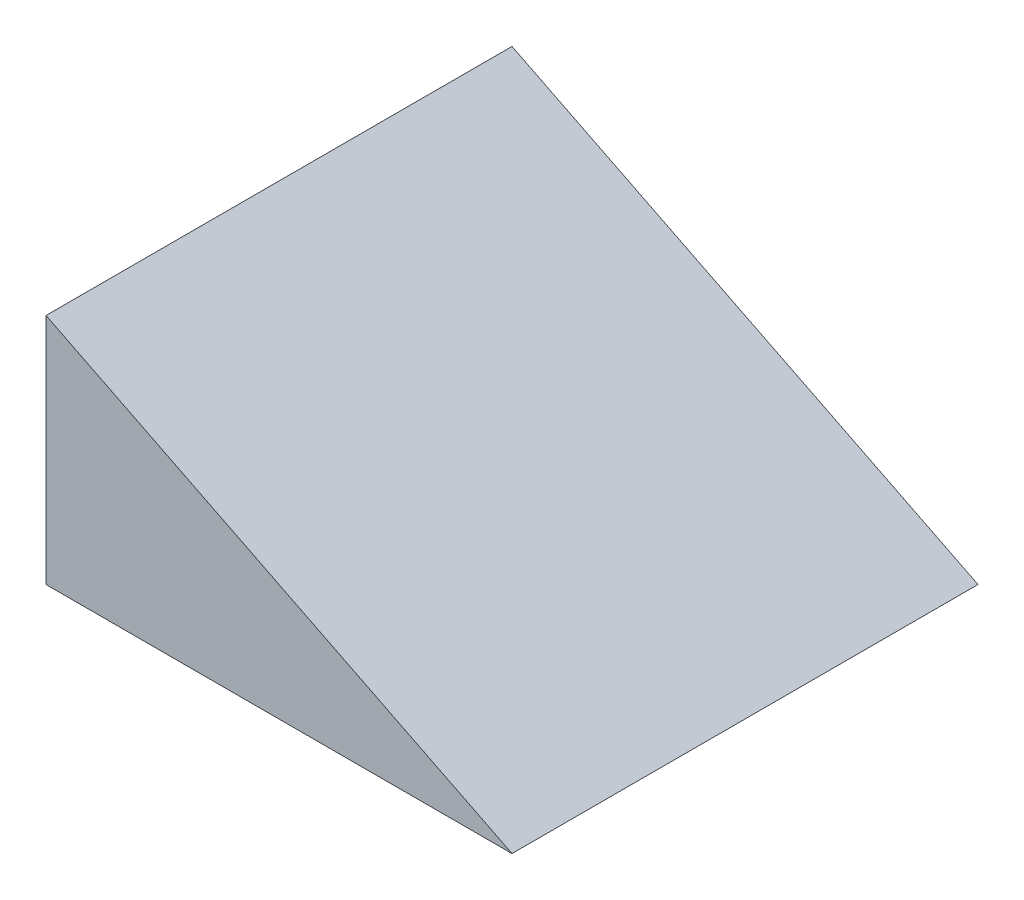
ISO-10303-21;
HEADER;
FILE_DESCRIPTION(('STEP AP214'),'2;1');
FILE_NAME('part.step','',(''),(''),'','','');
FILE_SCHEMA(('AUTOMOTIVE_DESIGN { 1 0 10303 214 1 1 1 1 }'));
ENDSEC;
DATA;
#1=APPLICATION_CONTEXT('core data for automotive mechanical design processes');
#2=APPLICATION_PROTOCOL_DEFINITION('international standard','automotive_design',2000,#1);
#3=PRODUCT_CONTEXT('',#1,'mechanical');
#4=PRODUCT('Part','Part','',(#3));
#5=PRODUCT_RELATED_PRODUCT_CATEGORY('part','',(#4));
#6=PRODUCT_DEFINITION_FORMATION('','',#4);
#7=PRODUCT_DEFINITION_CONTEXT('part definition',#1,'design');
#8=PRODUCT_DEFINITION('design','',#6,#7);
#9=PRODUCT_DEFINITION_SHAPE('','',#8);
#10=(LENGTH_UNIT() NAMED_UNIT(*) SI_UNIT(.MILLI.,.METRE.));
#11=(NAMED_UNIT(*) PLANE_ANGLE_UNIT() SI_UNIT($,.RADIAN.));
#12=(NAMED_UNIT(*) SI_UNIT($,.STERADIAN.) SOLID_ANGLE_UNIT());
#13=UNCERTAINTY_MEASURE_WITH_UNIT(LENGTH_MEASURE(1.E-05),#10,'distance_accuracy_value','');
#14=(GEOMETRIC_REPRESENTATION_CONTEXT(3) GLOBAL_UNCERTAINTY_ASSIGNED_CONTEXT((#13)) GLOBAL_UNIT_ASSIGNED_CONTEXT((#10,
#11,#12)) REPRESENTATION_CONTEXT('',''));
#15=CARTESIAN_POINT('',(0.,0.,0.));
#16=DIRECTION('',(0.,0.,1.));
#17=DIRECTION('',(1.,0.,0.));
#18=AXIS2_PLACEMENT_3D('',#15,#16,#17);
#19=CARTESIAN_POINT('',(0.,12.7,-12.7));
#20=DIRECTION('',(-1.,0.,0.));
#21=DIRECTION('',(0.,-1.,0.));
#22=AXIS2_PLACEMENT_3D('',#19,#20,#21);
#23=PLANE('',#22);
#24=DIRECTION('',(0.,0.,1.));
#25=VECTOR('',#24,1.);
#26=CARTESIAN_POINT('',(0.,0.,-12.7));
#27=LINE('',#26,#25);
#28=CARTESIAN_POINT('',(0.,0.,-12.7));
#29=VERTEX_POINT('',#28);
#30=CARTESIAN_POINT('',(0.,0.,12.7));
#31=VERTEX_POINT('',#30);
#32=EDGE_CURVE('E40',#29,#31,#27,.T.);
#33=ORIENTED_EDGE('',*,*,#32,.T.);
#34=DIRECTION('',(0.,-1.,0.));
#35=VECTOR('',#34,1.);
#36=CARTESIAN_POINT('',(0.,12.7,12.7));
#37=LINE('',#36,#35);
#38=CARTESIAN_POINT('',(0.,12.7,12.7));
#39=VERTEX_POINT('',#38);
#40=EDGE_CURVE('E71',#39,#31,#37,.T.);
#41=ORIENTED_EDGE('',*,*,#40,.F.);
#42=DIRECTION('',(0.,0.,1.));
#43=VECTOR('',#42,1.);
#44=CARTESIAN_POINT('',(0.,12.7,-12.7));
#45=LINE('',#44,#43);
#46=CARTESIAN_POINT('',(0.,12.7,-12.7));
#47=VERTEX_POINT('',#46);
#48=EDGE_CURVE('E11',#47,#39,#45,.T.);
#49=ORIENTED_EDGE('',*,*,#48,.F.);
#50=DIRECTION('',(0.,-1.,0.));
#51=VECTOR('',#50,1.);
#52=CARTESIAN_POINT('',(0.,12.7,-12.7));
#53=LINE('',#52,#51);
#54=EDGE_CURVE('E72',#47,#29,#53,.T.);
#55=ORIENTED_EDGE('',*,*,#54,.T.);
#56=EDGE_LOOP('',(#33,#41,#49,#55));
#57=FACE_BOUND('',#56,.T.);
#58=ADVANCED_FACE('F37',(#57),#23,.T.);
#59=CARTESIAN_POINT('',(25.4,0.,-12.7));
#60=DIRECTION('',(0.447213595499958,0.894427190999916,0.));
#61=DIRECTION('',(-0.894427190999916,0.447213595499958,0.));
#62=AXIS2_PLACEMENT_3D('',#59,#60,#61);
#63=PLANE('',#62);
#64=ORIENTED_EDGE('',*,*,#48,.T.);
#65=DIRECTION('',(-0.894427190999916,0.447213595499958,0.));
#66=VECTOR('',#65,1.);
#67=CARTESIAN_POINT('',(25.4,0.,12.7));
#68=LINE('',#67,#66);
#69=CARTESIAN_POINT('',(25.4,0.,12.7));
#70=VERTEX_POINT('',#69);
#71=EDGE_CURVE('E81',#70,#39,#68,.T.);
#72=ORIENTED_EDGE('',*,*,#71,.F.);
#73=DIRECTION('',(0.,0.,1.));
#74=VECTOR('',#73,1.);
#75=CARTESIAN_POINT('',(25.4,0.,-12.7));
#76=LINE('',#75,#74);
#77=CARTESIAN_POINT('',(25.4,0.,-12.7));
#78=VERTEX_POINT('',#77);
#79=EDGE_CURVE('E45',#78,#70,#76,.T.);
#80=ORIENTED_EDGE('',*,*,#79,.F.);
#81=DIRECTION('',(-0.894427190999916,0.447213595499958,0.));
#82=VECTOR('',#81,1.);
#83=CARTESIAN_POINT('',(25.4,0.,-12.7));
#84=LINE('',#83,#82);
#85=EDGE_CURVE('E75',#78,#47,#84,.T.);
#86=ORIENTED_EDGE('',*,*,#85,.T.);
#87=EDGE_LOOP('',(#64,#72,#80,#86));
#88=FACE_BOUND('',#87,.T.);
#89=ADVANCED_FACE('F91',(#88),#63,.T.);
#90=CARTESIAN_POINT('',(0.,0.,-12.7));
#91=DIRECTION('',(0.,-1.,0.));
#92=DIRECTION('',(0.,0.,-1.));
#93=AXIS2_PLACEMENT_3D('',#90,#91,#92);
#94=PLANE('',#93);
#95=ORIENTED_EDGE('',*,*,#79,.T.);
#96=DIRECTION('',(1.,0.,0.));
#97=VECTOR('',#96,1.);
#98=CARTESIAN_POINT('',(0.,0.,12.7));
#99=LINE('',#98,#97);
#100=EDGE_CURVE('E77',#31,#70,#99,.T.);
#101=ORIENTED_EDGE('',*,*,#100,.F.);
#102=ORIENTED_EDGE('',*,*,#32,.F.);
#103=DIRECTION('',(1.,0.,0.));
#104=VECTOR('',#103,1.);
#105=CARTESIAN_POINT('',(0.,0.,-12.7));
#106=LINE('',#105,#104);
#107=EDGE_CURVE('E88',#29,#78,#106,.T.);
#108=ORIENTED_EDGE('',*,*,#107,.T.);
#109=EDGE_LOOP('',(#95,#101,#102,#108));
#110=FACE_BOUND('',#109,.T.);
#111=ADVANCED_FACE('F78',(#110),#94,.T.);
#112=CARTESIAN_POINT('',(0.,0.,-12.7));
#113=DIRECTION('',(0.,0.,1.));
#114=DIRECTION('',(1.,0.,0.));
#115=AXIS2_PLACEMENT_3D('',#112,#113,#114);
#116=PLANE('',#115);
#117=ORIENTED_EDGE('',*,*,#54,.F.);
#118=ORIENTED_EDGE('',*,*,#85,.F.);
#119=ORIENTED_EDGE('',*,*,#107,.F.);
#120=EDGE_LOOP('',(#117,#118,#119));
#121=FACE_BOUND('',#120,.T.);
#122=ADVANCED_FACE('F93',(#121),#116,.F.);
#123=CARTESIAN_POINT('',(0.,0.,12.7));
#124=DIRECTION('',(0.,0.,1.));
#125=DIRECTION('',(1.,0.,0.));
#126=AXIS2_PLACEMENT_3D('',#123,#124,#125);
#127=PLANE('',#126);
#128=ORIENTED_EDGE('',*,*,#40,.T.);
#129=ORIENTED_EDGE('',*,*,#100,.T.);
#130=ORIENTED_EDGE('',*,*,#71,.T.);
#131=EDGE_LOOP('',(#128,#129,#130));
#132=FACE_BOUND('',#131,.T.);
#133=ADVANCED_FACE('F83',(#132),#127,.T.);
#134=CLOSED_SHELL('',(#58,#89,#111,#122,#133));
#135=MANIFOLD_SOLID_BREP('B2',#134);
#136=ADVANCED_BREP_SHAPE_REPRESENTATION('',(#18,#135),#14);
#137=SHAPE_DEFINITION_REPRESENTATION(#9,#136);
ENDSEC;
END-ISO-10303-21;
